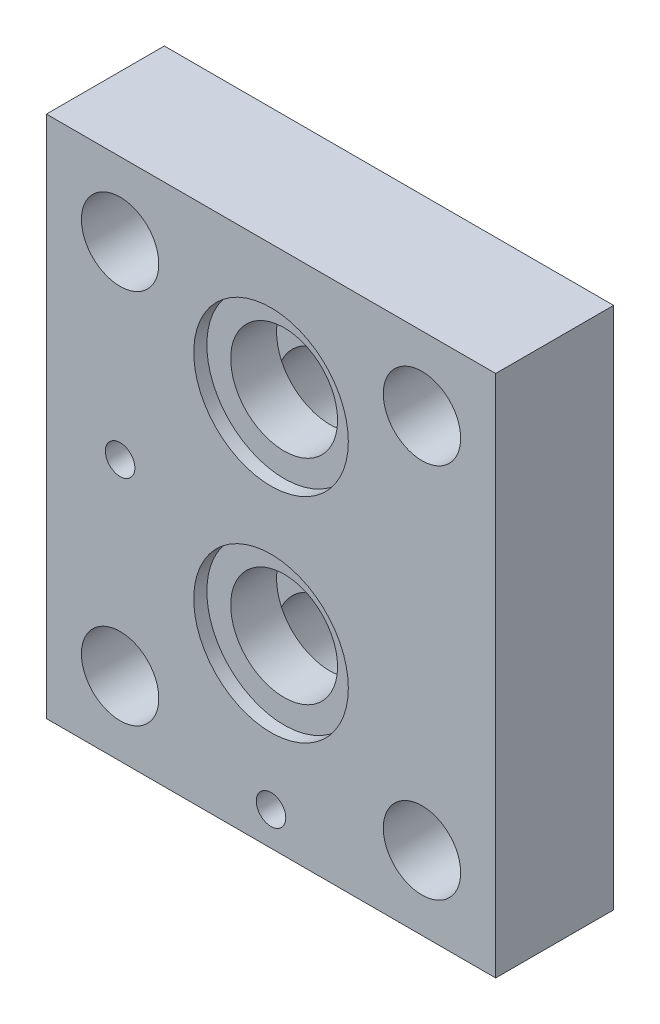
ISO-10303-21;
HEADER;
FILE_DESCRIPTION(('STEP AP214'),'2;1');
FILE_NAME('part.step','',(''),(''),'','','');
FILE_SCHEMA(('AUTOMOTIVE_DESIGN { 1 0 10303 214 1 1 1 1 }'));
ENDSEC;
DATA;
#1=APPLICATION_CONTEXT('core data for automotive mechanical design processes');
#2=APPLICATION_PROTOCOL_DEFINITION('international standard','automotive_design',2000,#1);
#3=PRODUCT_CONTEXT('',#1,'mechanical');
#4=PRODUCT('Part','Part','',(#3));
#5=PRODUCT_RELATED_PRODUCT_CATEGORY('part','',(#4));
#6=PRODUCT_DEFINITION_FORMATION('','',#4);
#7=PRODUCT_DEFINITION_CONTEXT('part definition',#1,'design');
#8=PRODUCT_DEFINITION('design','',#6,#7);
#9=PRODUCT_DEFINITION_SHAPE('','',#8);
#10=(LENGTH_UNIT() NAMED_UNIT(*) SI_UNIT(.MILLI.,.METRE.));
#11=(NAMED_UNIT(*) PLANE_ANGLE_UNIT() SI_UNIT($,.RADIAN.));
#12=(NAMED_UNIT(*) SI_UNIT($,.STERADIAN.) SOLID_ANGLE_UNIT());
#13=UNCERTAINTY_MEASURE_WITH_UNIT(LENGTH_MEASURE(1.E-05),#10,'distance_accuracy_value','');
#14=(GEOMETRIC_REPRESENTATION_CONTEXT(3) GLOBAL_UNCERTAINTY_ASSIGNED_CONTEXT((#13)) GLOBAL_UNIT_ASSIGNED_CONTEXT((#10,
#11,#12)) REPRESENTATION_CONTEXT('',''));
#15=CARTESIAN_POINT('',(0.,0.,0.));
#16=DIRECTION('',(0.,0.,1.));
#17=DIRECTION('',(1.,0.,0.));
#18=AXIS2_PLACEMENT_3D('',#15,#16,#17);
#19=CARTESIAN_POINT('',(0.,27.813,0.));
#20=DIRECTION('',(0.,0.,1.));
#21=DIRECTION('',(1.,0.,0.));
#22=AXIS2_PLACEMENT_3D('',#19,#20,#21);
#23=CYLINDRICAL_SURFACE('',#22,11.509375);
#24=CARTESIAN_POINT('',(0.,27.813,0.));
#25=DIRECTION('',(0.,0.,1.));
#26=DIRECTION('',(1.,0.,0.));
#27=AXIS2_PLACEMENT_3D('',#24,#25,#26);
#28=CIRCLE('',#27,11.509375);
#29=CARTESIAN_POINT('',(-10.4487050341478,22.987,0.));
#30=VERTEX_POINT('',#29);
#31=CARTESIAN_POINT('',(10.4487050341478,22.987,0.));
#32=VERTEX_POINT('',#31);
#33=EDGE_CURVE('E142',#30,#32,#28,.T.);
#34=ORIENTED_EDGE('',*,*,#33,.F.);
#35=EDGE_CURVE('E59',#32,#30,#28,.T.);
#36=ORIENTED_EDGE('',*,*,#35,.F.);
#37=EDGE_LOOP('',(#34,#36));
#38=FACE_BOUND('',#37,.T.);
#39=CARTESIAN_POINT('',(0.,27.813,9.8806));
#40=DIRECTION('',(0.,0.,1.));
#41=DIRECTION('',(1.,0.,0.));
#42=AXIS2_PLACEMENT_3D('',#39,#40,#41);
#43=CIRCLE('',#42,11.509375);
#44=CARTESIAN_POINT('',(11.509375,27.813,9.8806));
#45=VERTEX_POINT('',#44);
#46=EDGE_CURVE('E47',#45,#45,#43,.F.);
#47=ORIENTED_EDGE('',*,*,#46,.F.);
#48=EDGE_LOOP('',(#47));
#49=FACE_BOUND('',#48,.T.);
#50=ADVANCED_FACE('F43',(#38,#49),#23,.F.);
#51=CARTESIAN_POINT('',(0.,-18.161,0.));
#52=DIRECTION('',(0.,0.,1.));
#53=DIRECTION('',(1.,0.,0.));
#54=AXIS2_PLACEMENT_3D('',#51,#52,#53);
#55=CYLINDRICAL_SURFACE('',#54,11.509375);
#56=CARTESIAN_POINT('',(0.,-18.161,0.));
#57=DIRECTION('',(0.,0.,1.));
#58=DIRECTION('',(1.,0.,0.));
#59=AXIS2_PLACEMENT_3D('',#56,#57,#58);
#60=CIRCLE('',#59,11.509375);
#61=CARTESIAN_POINT('',(-10.4487050341478,-22.987,0.));
#62=VERTEX_POINT('',#61);
#63=CARTESIAN_POINT('',(10.4487050341478,-22.987,0.));
#64=VERTEX_POINT('',#63);
#65=EDGE_CURVE('E138',#62,#64,#60,.T.);
#66=ORIENTED_EDGE('',*,*,#65,.F.);
#67=EDGE_CURVE('E66',#64,#62,#60,.T.);
#68=ORIENTED_EDGE('',*,*,#67,.F.);
#69=EDGE_LOOP('',(#66,#68));
#70=FACE_BOUND('',#69,.T.);
#71=CARTESIAN_POINT('',(0.,-18.161,9.8806));
#72=DIRECTION('',(0.,0.,1.));
#73=DIRECTION('',(1.,0.,0.));
#74=AXIS2_PLACEMENT_3D('',#71,#72,#73);
#75=CIRCLE('',#74,11.509375);
#76=CARTESIAN_POINT('',(11.509375,-18.161,9.8806));
#77=VERTEX_POINT('',#76);
#78=EDGE_CURVE('E129',#77,#77,#75,.F.);
#79=ORIENTED_EDGE('',*,*,#78,.F.);
#80=EDGE_LOOP('',(#79));
#81=FACE_BOUND('',#80,.T.);
#82=ADVANCED_FACE('F274',(#70,#81),#55,.F.);
#83=CARTESIAN_POINT('',(48.387,56.388,12.7));
#84=DIRECTION('',(0.,-1.,0.));
#85=DIRECTION('',(0.,0.,-1.));
#86=AXIS2_PLACEMENT_3D('',#83,#84,#85);
#87=PLANE('',#86);
#88=DIRECTION('',(-1.,0.,0.));
#89=VECTOR('',#88,1.);
#90=CARTESIAN_POINT('',(48.387,56.388,-12.7));
#91=LINE('',#90,#89);
#92=CARTESIAN_POINT('',(48.387,56.388,-12.7));
#93=VERTEX_POINT('',#92);
#94=CARTESIAN_POINT('',(-48.387,56.388,-12.7));
#95=VERTEX_POINT('',#94);
#96=EDGE_CURVE('E182',#93,#95,#91,.T.);
#97=ORIENTED_EDGE('',*,*,#96,.T.);
#98=DIRECTION('',(0.,0.,-1.));
#99=VECTOR('',#98,1.);
#100=CARTESIAN_POINT('',(-48.387,56.388,12.7));
#101=LINE('',#100,#99);
#102=CARTESIAN_POINT('',(-48.387,56.388,12.7));
#103=VERTEX_POINT('',#102);
#104=EDGE_CURVE('E11',#103,#95,#101,.T.);
#105=ORIENTED_EDGE('',*,*,#104,.F.);
#106=DIRECTION('',(-1.,0.,0.));
#107=VECTOR('',#106,1.);
#108=CARTESIAN_POINT('',(48.387,56.388,12.7));
#109=LINE('',#108,#107);
#110=CARTESIAN_POINT('',(48.387,56.388,12.7));
#111=VERTEX_POINT('',#110);
#112=EDGE_CURVE('E183',#111,#103,#109,.T.);
#113=ORIENTED_EDGE('',*,*,#112,.F.);
#114=DIRECTION('',(0.,0.,-1.));
#115=VECTOR('',#114,1.);
#116=CARTESIAN_POINT('',(48.387,56.388,12.7));
#117=LINE('',#116,#115);
#118=EDGE_CURVE('E193',#111,#93,#117,.T.);
#119=ORIENTED_EDGE('',*,*,#118,.T.);
#120=EDGE_LOOP('',(#97,#105,#113,#119));
#121=FACE_BOUND('',#120,.T.);
#122=ADVANCED_FACE('F45',(#121),#87,.F.);
#123=CARTESIAN_POINT('',(-48.387,-56.388,12.7));
#124=DIRECTION('',(1.,0.,0.));
#125=DIRECTION('',(0.,0.,-1.));
#126=AXIS2_PLACEMENT_3D('',#123,#124,#125);
#127=PLANE('',#126);
#128=DIRECTION('',(0.,-1.,0.));
#129=VECTOR('',#128,1.);
#130=CARTESIAN_POINT('',(-48.387,-56.388,-12.7));
#131=LINE('',#130,#129);
#132=CARTESIAN_POINT('',(-48.387,-56.388,-12.7));
#133=VERTEX_POINT('',#132);
#134=EDGE_CURVE('E196',#95,#133,#131,.T.);
#135=ORIENTED_EDGE('',*,*,#134,.T.);
#136=DIRECTION('',(0.,0.,-1.));
#137=VECTOR('',#136,1.);
#138=CARTESIAN_POINT('',(-48.387,-56.388,12.7));
#139=LINE('',#138,#137);
#140=CARTESIAN_POINT('',(-48.387,-56.388,12.7));
#141=VERTEX_POINT('',#140);
#142=EDGE_CURVE('E52',#141,#133,#139,.T.);
#143=ORIENTED_EDGE('',*,*,#142,.F.);
#144=DIRECTION('',(0.,-1.,0.));
#145=VECTOR('',#144,1.);
#146=CARTESIAN_POINT('',(-48.387,-56.388,12.7));
#147=LINE('',#146,#145);
#148=EDGE_CURVE('E186',#103,#141,#147,.T.);
#149=ORIENTED_EDGE('',*,*,#148,.F.);
#150=ORIENTED_EDGE('',*,*,#104,.T.);
#151=EDGE_LOOP('',(#135,#143,#149,#150));
#152=FACE_BOUND('',#151,.T.);
#153=ADVANCED_FACE('F259',(#152),#127,.F.);
#154=CARTESIAN_POINT('',(48.387,-56.388,12.7));
#155=DIRECTION('',(0.,1.,0.));
#156=DIRECTION('',(0.,0.,1.));
#157=AXIS2_PLACEMENT_3D('',#154,#155,#156);
#158=PLANE('',#157);
#159=DIRECTION('',(1.,0.,0.));
#160=VECTOR('',#159,1.);
#161=CARTESIAN_POINT('',(48.387,-56.388,-12.7));
#162=LINE('',#161,#160);
#163=CARTESIAN_POINT('',(48.387,-56.388,-12.7));
#164=VERTEX_POINT('',#163);
#165=EDGE_CURVE('E198',#133,#164,#162,.T.);
#166=ORIENTED_EDGE('',*,*,#165,.T.);
#167=DIRECTION('',(0.,0.,-1.));
#168=VECTOR('',#167,1.);
#169=CARTESIAN_POINT('',(48.387,-56.388,12.7));
#170=LINE('',#169,#168);
#171=CARTESIAN_POINT('',(48.387,-56.388,12.7));
#172=VERTEX_POINT('',#171);
#173=EDGE_CURVE('E203',#172,#164,#170,.T.);
#174=ORIENTED_EDGE('',*,*,#173,.F.);
#175=DIRECTION('',(1.,0.,0.));
#176=VECTOR('',#175,1.);
#177=CARTESIAN_POINT('',(48.387,-56.388,12.7));
#178=LINE('',#177,#176);
#179=EDGE_CURVE('E189',#141,#172,#178,.T.);
#180=ORIENTED_EDGE('',*,*,#179,.F.);
#181=ORIENTED_EDGE('',*,*,#142,.T.);
#182=EDGE_LOOP('',(#166,#174,#180,#181));
#183=FACE_BOUND('',#182,.T.);
#184=ADVANCED_FACE('F256',(#183),#158,.F.);
#185=CARTESIAN_POINT('',(48.387,-56.388,12.7));
#186=DIRECTION('',(-1.,0.,0.));
#187=DIRECTION('',(0.,0.,1.));
#188=AXIS2_PLACEMENT_3D('',#185,#186,#187);
#189=PLANE('',#188);
#190=DIRECTION('',(0.,1.,0.));
#191=VECTOR('',#190,1.);
#192=CARTESIAN_POINT('',(48.387,-56.388,-12.7));
#193=LINE('',#192,#191);
#194=EDGE_CURVE('E187',#164,#93,#193,.T.);
#195=ORIENTED_EDGE('',*,*,#194,.T.);
#196=ORIENTED_EDGE('',*,*,#118,.F.);
#197=DIRECTION('',(0.,1.,0.));
#198=VECTOR('',#197,1.);
#199=CARTESIAN_POINT('',(48.387,-56.388,12.7));
#200=LINE('',#199,#198);
#201=EDGE_CURVE('E191',#172,#111,#200,.T.);
#202=ORIENTED_EDGE('',*,*,#201,.F.);
#203=ORIENTED_EDGE('',*,*,#173,.T.);
#204=EDGE_LOOP('',(#195,#196,#202,#203));
#205=FACE_BOUND('',#204,.T.);
#206=ADVANCED_FACE('F252',(#205),#189,.F.);
#207=CARTESIAN_POINT('',(0.,0.,12.7));
#208=DIRECTION('',(0.,0.,-1.));
#209=DIRECTION('',(-1.,0.,0.));
#210=AXIS2_PLACEMENT_3D('',#207,#208,#209);
#211=PLANE('',#210);
#212=CARTESIAN_POINT('',(0.,-49.149,12.7));
#213=DIRECTION('',(0.,0.,1.));
#214=DIRECTION('',(1.,0.,0.));
#215=AXIS2_PLACEMENT_3D('',#212,#213,#214);
#216=CIRCLE('',#215,3.175);
#217=CARTESIAN_POINT('',(3.175,-49.149,12.7));
#218=VERTEX_POINT('',#217);
#219=EDGE_CURVE('E489',#218,#218,#216,.T.);
#220=ORIENTED_EDGE('',*,*,#219,.F.);
#221=EDGE_LOOP('',(#220));
#222=FACE_BOUND('',#221,.T.);
#223=CARTESIAN_POINT('',(-32.512,-0.127000000000009,12.7));
#224=DIRECTION('',(0.,0.,1.));
#225=DIRECTION('',(1.,0.,0.));
#226=AXIS2_PLACEMENT_3D('',#223,#224,#225);
#227=CIRCLE('',#226,3.175);
#228=CARTESIAN_POINT('',(-29.337,-0.127000000000009,12.7));
#229=VERTEX_POINT('',#228);
#230=EDGE_CURVE('E492',#229,#229,#227,.T.);
#231=ORIENTED_EDGE('',*,*,#230,.F.);
#232=EDGE_LOOP('',(#231));
#233=FACE_BOUND('',#232,.T.);
#234=CARTESIAN_POINT('',(0.,-18.161,12.7));
#235=DIRECTION('',(0.,0.,1.));
#236=DIRECTION('',(1.,0.,0.));
#237=AXIS2_PLACEMENT_3D('',#234,#235,#236);
#238=CIRCLE('',#237,16.6497);
#239=CARTESIAN_POINT('',(16.6497,-18.161,12.7));
#240=VERTEX_POINT('',#239);
#241=EDGE_CURVE('E130',#240,#240,#238,.T.);
#242=ORIENTED_EDGE('',*,*,#241,.F.);
#243=EDGE_LOOP('',(#242));
#244=FACE_BOUND('',#243,.T.);
#245=CARTESIAN_POINT('',(0.,27.813,12.7));
#246=DIRECTION('',(0.,0.,1.));
#247=DIRECTION('',(1.,0.,0.));
#248=AXIS2_PLACEMENT_3D('',#245,#246,#247);
#249=CIRCLE('',#248,16.6497);
#250=CARTESIAN_POINT('',(16.6497,27.813,12.7));
#251=VERTEX_POINT('',#250);
#252=EDGE_CURVE('E133',#251,#251,#249,.T.);
#253=ORIENTED_EDGE('',*,*,#252,.F.);
#254=EDGE_LOOP('',(#253));
#255=FACE_BOUND('',#254,.T.);
#256=CARTESIAN_POINT('',(32.512,-40.513,12.7));
#257=DIRECTION('',(0.,0.,-1.));
#258=DIRECTION('',(-1.,0.,0.));
#259=AXIS2_PLACEMENT_3D('',#256,#257,#258);
#260=CIRCLE('',#259,8.33437499999998);
#261=CARTESIAN_POINT('',(24.177625,-40.513,12.7));
#262=VERTEX_POINT('',#261);
#263=EDGE_CURVE('E161',#262,#262,#260,.T.);
#264=ORIENTED_EDGE('',*,*,#263,.T.);
#265=EDGE_LOOP('',(#264));
#266=FACE_BOUND('',#265,.T.);
#267=CARTESIAN_POINT('',(32.512,40.513,12.7));
#268=DIRECTION('',(0.,0.,-1.));
#269=DIRECTION('',(-1.,0.,0.));
#270=AXIS2_PLACEMENT_3D('',#267,#268,#269);
#271=CIRCLE('',#270,8.33437499999998);
#272=CARTESIAN_POINT('',(24.177625,40.513,12.7));
#273=VERTEX_POINT('',#272);
#274=EDGE_CURVE('E167',#273,#273,#271,.T.);
#275=ORIENTED_EDGE('',*,*,#274,.T.);
#276=EDGE_LOOP('',(#275));
#277=FACE_BOUND('',#276,.T.);
#278=CARTESIAN_POINT('',(-32.512,-40.513,12.7));
#279=DIRECTION('',(0.,0.,-1.));
#280=DIRECTION('',(-1.,0.,0.));
#281=AXIS2_PLACEMENT_3D('',#278,#279,#280);
#282=CIRCLE('',#281,8.33437499999998);
#283=CARTESIAN_POINT('',(-40.846375,-40.513,12.7));
#284=VERTEX_POINT('',#283);
#285=EDGE_CURVE('E173',#284,#284,#282,.T.);
#286=ORIENTED_EDGE('',*,*,#285,.T.);
#287=EDGE_LOOP('',(#286));
#288=FACE_BOUND('',#287,.T.);
#289=CARTESIAN_POINT('',(-32.512,40.513,12.7));
#290=DIRECTION('',(0.,0.,-1.));
#291=DIRECTION('',(-1.,0.,0.));
#292=AXIS2_PLACEMENT_3D('',#289,#290,#291);
#293=CIRCLE('',#292,8.33437499999998);
#294=CARTESIAN_POINT('',(-40.846375,40.513,12.7));
#295=VERTEX_POINT('',#294);
#296=EDGE_CURVE('E179',#295,#295,#293,.T.);
#297=ORIENTED_EDGE('',*,*,#296,.T.);
#298=EDGE_LOOP('',(#297));
#299=FACE_BOUND('',#298,.T.);
#300=ORIENTED_EDGE('',*,*,#112,.T.);
#301=ORIENTED_EDGE('',*,*,#148,.T.);
#302=ORIENTED_EDGE('',*,*,#179,.T.);
#303=ORIENTED_EDGE('',*,*,#201,.T.);
#304=EDGE_LOOP('',(#300,#301,#302,#303));
#305=FACE_BOUND('',#304,.T.);
#306=ADVANCED_FACE('F232',(#222,#233,#244,#255,#266,#277,#288,#299,#305),#211,.F.);
#307=CARTESIAN_POINT('',(0.,0.,-12.7));
#308=DIRECTION('',(0.,0.,-1.));
#309=DIRECTION('',(-1.,0.,0.));
#310=AXIS2_PLACEMENT_3D('',#307,#308,#309);
#311=PLANE('',#310);
#312=CARTESIAN_POINT('',(0.,49.149,-12.7));
#313=DIRECTION('',(0.,0.,-1.));
#314=DIRECTION('',(-1.,0.,0.));
#315=AXIS2_PLACEMENT_3D('',#312,#313,#314);
#316=CIRCLE('',#315,3.57187499999999);
#317=CARTESIAN_POINT('',(-3.57187499999999,49.149,-12.7));
#318=VERTEX_POINT('',#317);
#319=EDGE_CURVE('E113',#318,#318,#316,.T.);
#320=ORIENTED_EDGE('',*,*,#319,.F.);
#321=EDGE_LOOP('',(#320));
#322=FACE_BOUND('',#321,.T.);
#323=CARTESIAN_POINT('',(32.512,0.126999999999986,-12.7));
#324=DIRECTION('',(0.,0.,-1.));
#325=DIRECTION('',(-1.,0.,0.));
#326=AXIS2_PLACEMENT_3D('',#323,#324,#325);
#327=CIRCLE('',#326,3.57187499999999);
#328=CARTESIAN_POINT('',(28.940125,0.126999999999986,-12.7));
#329=VERTEX_POINT('',#328);
#330=EDGE_CURVE('E112',#329,#329,#327,.T.);
#331=ORIENTED_EDGE('',*,*,#330,.F.);
#332=EDGE_LOOP('',(#331));
#333=FACE_BOUND('',#332,.T.);
#334=CARTESIAN_POINT('',(0.,-27.813,-12.7));
#335=DIRECTION('',(0.,0.,1.));
#336=DIRECTION('',(1.,0.,0.));
#337=AXIS2_PLACEMENT_3D('',#334,#335,#336);
#338=CIRCLE('',#337,11.509375);
#339=CARTESIAN_POINT('',(11.509375,-27.813,-12.7));
#340=VERTEX_POINT('',#339);
#341=EDGE_CURVE('E150',#340,#340,#338,.T.);
#342=ORIENTED_EDGE('',*,*,#341,.T.);
#343=EDGE_LOOP('',(#342));
#344=FACE_BOUND('',#343,.T.);
#345=CARTESIAN_POINT('',(0.,18.161,-12.7));
#346=DIRECTION('',(0.,0.,1.));
#347=DIRECTION('',(1.,0.,0.));
#348=AXIS2_PLACEMENT_3D('',#345,#346,#347);
#349=CIRCLE('',#348,11.509375);
#350=CARTESIAN_POINT('',(11.509375,18.161,-12.7));
#351=VERTEX_POINT('',#350);
#352=EDGE_CURVE('E153',#351,#351,#349,.T.);
#353=ORIENTED_EDGE('',*,*,#352,.T.);
#354=EDGE_LOOP('',(#353));
#355=FACE_BOUND('',#354,.T.);
#356=CARTESIAN_POINT('',(32.512,-40.513,-12.7));
#357=DIRECTION('',(0.,0.,-1.));
#358=DIRECTION('',(-1.,0.,0.));
#359=AXIS2_PLACEMENT_3D('',#356,#357,#358);
#360=CIRCLE('',#359,8.33437499999999);
#361=CARTESIAN_POINT('',(24.177625,-40.513,-12.7));
#362=VERTEX_POINT('',#361);
#363=EDGE_CURVE('E148',#362,#362,#360,.T.);
#364=ORIENTED_EDGE('',*,*,#363,.F.);
#365=EDGE_LOOP('',(#364));
#366=FACE_BOUND('',#365,.T.);
#367=CARTESIAN_POINT('',(32.512,40.513,-12.7));
#368=DIRECTION('',(0.,0.,-1.));
#369=DIRECTION('',(-1.,0.,0.));
#370=AXIS2_PLACEMENT_3D('',#367,#368,#369);
#371=CIRCLE('',#370,8.33437499999999);
#372=CARTESIAN_POINT('',(24.177625,40.513,-12.7));
#373=VERTEX_POINT('',#372);
#374=EDGE_CURVE('E164',#373,#373,#371,.T.);
#375=ORIENTED_EDGE('',*,*,#374,.F.);
#376=EDGE_LOOP('',(#375));
#377=FACE_BOUND('',#376,.T.);
#378=CARTESIAN_POINT('',(-32.512,-40.513,-12.7));
#379=DIRECTION('',(0.,0.,-1.));
#380=DIRECTION('',(-1.,0.,0.));
#381=AXIS2_PLACEMENT_3D('',#378,#379,#380);
#382=CIRCLE('',#381,8.33437499999999);
#383=CARTESIAN_POINT('',(-40.846375,-40.513,-12.7));
#384=VERTEX_POINT('',#383);
#385=EDGE_CURVE('E170',#384,#384,#382,.T.);
#386=ORIENTED_EDGE('',*,*,#385,.F.);
#387=EDGE_LOOP('',(#386));
#388=FACE_BOUND('',#387,.T.);
#389=CARTESIAN_POINT('',(-32.512,40.513,-12.7));
#390=DIRECTION('',(0.,0.,-1.));
#391=DIRECTION('',(-1.,0.,0.));
#392=AXIS2_PLACEMENT_3D('',#389,#390,#391);
#393=CIRCLE('',#392,8.33437499999999);
#394=CARTESIAN_POINT('',(-40.846375,40.513,-12.7));
#395=VERTEX_POINT('',#394);
#396=EDGE_CURVE('E176',#395,#395,#393,.T.);
#397=ORIENTED_EDGE('',*,*,#396,.F.);
#398=EDGE_LOOP('',(#397));
#399=FACE_BOUND('',#398,.T.);
#400=ORIENTED_EDGE('',*,*,#96,.F.);
#401=ORIENTED_EDGE('',*,*,#194,.F.);
#402=ORIENTED_EDGE('',*,*,#165,.F.);
#403=ORIENTED_EDGE('',*,*,#134,.F.);
#404=EDGE_LOOP('',(#400,#401,#402,#403));
#405=FACE_BOUND('',#404,.T.);
#406=ADVANCED_FACE('F228',(#322,#333,#344,#355,#366,#377,#388,#399,#405),#311,.T.);
#407=CARTESIAN_POINT('',(-32.512,40.513,-12.7));
#408=DIRECTION('',(0.,0.,-1.));
#409=DIRECTION('',(-1.,0.,0.));
#410=AXIS2_PLACEMENT_3D('',#407,#408,#409);
#411=CYLINDRICAL_SURFACE('',#410,8.33437499999999);
#412=ORIENTED_EDGE('',*,*,#296,.F.);
#413=EDGE_LOOP('',(#412));
#414=FACE_BOUND('',#413,.T.);
#415=ORIENTED_EDGE('',*,*,#396,.T.);
#416=EDGE_LOOP('',(#415));
#417=FACE_BOUND('',#416,.T.);
#418=ADVANCED_FACE('F231',(#414,#417),#411,.F.);
#419=CARTESIAN_POINT('',(-32.512,-40.513,-12.7));
#420=DIRECTION('',(0.,0.,-1.));
#421=DIRECTION('',(-1.,0.,0.));
#422=AXIS2_PLACEMENT_3D('',#419,#420,#421);
#423=CYLINDRICAL_SURFACE('',#422,8.33437499999999);
#424=ORIENTED_EDGE('',*,*,#285,.F.);
#425=EDGE_LOOP('',(#424));
#426=FACE_BOUND('',#425,.T.);
#427=ORIENTED_EDGE('',*,*,#385,.T.);
#428=EDGE_LOOP('',(#427));
#429=FACE_BOUND('',#428,.T.);
#430=ADVANCED_FACE('F302',(#426,#429),#423,.F.);
#431=CARTESIAN_POINT('',(32.512,40.513,-12.7));
#432=DIRECTION('',(0.,0.,-1.));
#433=DIRECTION('',(-1.,0.,0.));
#434=AXIS2_PLACEMENT_3D('',#431,#432,#433);
#435=CYLINDRICAL_SURFACE('',#434,8.33437499999999);
#436=ORIENTED_EDGE('',*,*,#274,.F.);
#437=EDGE_LOOP('',(#436));
#438=FACE_BOUND('',#437,.T.);
#439=ORIENTED_EDGE('',*,*,#374,.T.);
#440=EDGE_LOOP('',(#439));
#441=FACE_BOUND('',#440,.T.);
#442=ADVANCED_FACE('F298',(#438,#441),#435,.F.);
#443=CARTESIAN_POINT('',(32.512,-40.513,-12.7));
#444=DIRECTION('',(0.,0.,-1.));
#445=DIRECTION('',(-1.,0.,0.));
#446=AXIS2_PLACEMENT_3D('',#443,#444,#445);
#447=CYLINDRICAL_SURFACE('',#446,8.33437499999999);
#448=ORIENTED_EDGE('',*,*,#263,.F.);
#449=EDGE_LOOP('',(#448));
#450=FACE_BOUND('',#449,.T.);
#451=ORIENTED_EDGE('',*,*,#363,.T.);
#452=EDGE_LOOP('',(#451));
#453=FACE_BOUND('',#452,.T.);
#454=ADVANCED_FACE('F224',(#450,#453),#447,.F.);
#455=CARTESIAN_POINT('',(0.,18.161,0.));
#456=DIRECTION('',(0.,0.,-1.));
#457=DIRECTION('',(-1.,0.,0.));
#458=AXIS2_PLACEMENT_3D('',#455,#456,#457);
#459=CYLINDRICAL_SURFACE('',#458,11.509375);
#460=CARTESIAN_POINT('',(0.,18.161,0.));
#461=DIRECTION('',(0.,0.,1.));
#462=DIRECTION('',(1.,0.,0.));
#463=AXIS2_PLACEMENT_3D('',#460,#461,#462);
#464=CIRCLE('',#463,11.509375);
#465=EDGE_CURVE('E156',#32,#30,#464,.T.);
#466=ORIENTED_EDGE('',*,*,#465,.T.);
#467=EDGE_CURVE('E141',#30,#32,#464,.T.);
#468=ORIENTED_EDGE('',*,*,#467,.T.);
#469=EDGE_LOOP('',(#466,#468));
#470=FACE_BOUND('',#469,.T.);
#471=ORIENTED_EDGE('',*,*,#352,.F.);
#472=EDGE_LOOP('',(#471));
#473=FACE_BOUND('',#472,.T.);
#474=ADVANCED_FACE('F221',(#470,#473),#459,.F.);
#475=CARTESIAN_POINT('',(0.,18.161,0.));
#476=DIRECTION('',(0.,0.,1.));
#477=DIRECTION('',(1.,0.,0.));
#478=AXIS2_PLACEMENT_3D('',#475,#476,#477);
#479=PLANE('',#478);
#480=ORIENTED_EDGE('',*,*,#467,.F.);
#481=ORIENTED_EDGE('',*,*,#33,.T.);
#482=EDGE_LOOP('',(#480,#481));
#483=FACE_BOUND('',#482,.T.);
#484=ADVANCED_FACE('F219',(#483),#479,.F.);
#485=CARTESIAN_POINT('',(0.,-27.813,0.));
#486=DIRECTION('',(0.,0.,-1.));
#487=DIRECTION('',(-1.,0.,0.));
#488=AXIS2_PLACEMENT_3D('',#485,#486,#487);
#489=CYLINDRICAL_SURFACE('',#488,11.509375);
#490=CARTESIAN_POINT('',(0.,-27.813,0.));
#491=DIRECTION('',(0.,0.,1.));
#492=DIRECTION('',(1.,0.,0.));
#493=AXIS2_PLACEMENT_3D('',#490,#491,#492);
#494=CIRCLE('',#493,11.509375);
#495=EDGE_CURVE('E145',#64,#62,#494,.T.);
#496=ORIENTED_EDGE('',*,*,#495,.T.);
#497=EDGE_CURVE('E149',#62,#64,#494,.T.);
#498=ORIENTED_EDGE('',*,*,#497,.T.);
#499=EDGE_LOOP('',(#496,#498));
#500=FACE_BOUND('',#499,.T.);
#501=ORIENTED_EDGE('',*,*,#341,.F.);
#502=EDGE_LOOP('',(#501));
#503=FACE_BOUND('',#502,.T.);
#504=ADVANCED_FACE('F289',(#500,#503),#489,.F.);
#505=CARTESIAN_POINT('',(0.,-27.813,0.));
#506=DIRECTION('',(0.,0.,1.));
#507=DIRECTION('',(1.,0.,0.));
#508=AXIS2_PLACEMENT_3D('',#505,#506,#507);
#509=PLANE('',#508);
#510=ORIENTED_EDGE('',*,*,#497,.F.);
#511=ORIENTED_EDGE('',*,*,#65,.T.);
#512=EDGE_LOOP('',(#510,#511));
#513=FACE_BOUND('',#512,.T.);
#514=ADVANCED_FACE('F286',(#513),#509,.F.);
#515=CARTESIAN_POINT('',(0.,27.813,0.));
#516=DIRECTION('',(0.,0.,1.));
#517=DIRECTION('',(1.,0.,0.));
#518=AXIS2_PLACEMENT_3D('',#515,#516,#517);
#519=PLANE('',#518);
#520=ORIENTED_EDGE('',*,*,#35,.T.);
#521=ORIENTED_EDGE('',*,*,#465,.F.);
#522=EDGE_LOOP('',(#520,#521));
#523=FACE_BOUND('',#522,.T.);
#524=ADVANCED_FACE('F214',(#523),#519,.T.);
#525=CARTESIAN_POINT('',(0.,-18.161,0.));
#526=DIRECTION('',(0.,0.,1.));
#527=DIRECTION('',(1.,0.,0.));
#528=AXIS2_PLACEMENT_3D('',#525,#526,#527);
#529=PLANE('',#528);
#530=ORIENTED_EDGE('',*,*,#67,.T.);
#531=ORIENTED_EDGE('',*,*,#495,.F.);
#532=EDGE_LOOP('',(#530,#531));
#533=FACE_BOUND('',#532,.T.);
#534=ADVANCED_FACE('F285',(#533),#529,.T.);
#535=CARTESIAN_POINT('',(0.,-18.161,9.8806));
#536=DIRECTION('',(0.,0.,1.));
#537=DIRECTION('',(1.,0.,0.));
#538=AXIS2_PLACEMENT_3D('',#535,#536,#537);
#539=PLANE('',#538);
#540=CARTESIAN_POINT('',(0.,-18.161,9.8806));
#541=DIRECTION('',(0.,0.,1.));
#542=DIRECTION('',(1.,0.,0.));
#543=AXIS2_PLACEMENT_3D('',#540,#541,#542);
#544=CIRCLE('',#543,16.6497);
#545=CARTESIAN_POINT('',(16.6497,-18.161,9.8806));
#546=VERTEX_POINT('',#545);
#547=EDGE_CURVE('E126',#546,#546,#544,.T.);
#548=ORIENTED_EDGE('',*,*,#547,.T.);
#549=EDGE_LOOP('',(#548));
#550=FACE_BOUND('',#549,.T.);
#551=ORIENTED_EDGE('',*,*,#78,.T.);
#552=EDGE_LOOP('',(#551));
#553=FACE_BOUND('',#552,.T.);
#554=ADVANCED_FACE('F362',(#550,#553),#539,.T.);
#555=CARTESIAN_POINT('',(0.,-18.161,9.8806));
#556=DIRECTION('',(0.,0.,1.));
#557=DIRECTION('',(1.,0.,0.));
#558=AXIS2_PLACEMENT_3D('',#555,#556,#557);
#559=CYLINDRICAL_SURFACE('',#558,16.6497);
#560=ORIENTED_EDGE('',*,*,#547,.F.);
#561=EDGE_LOOP('',(#560));
#562=FACE_BOUND('',#561,.T.);
#563=ORIENTED_EDGE('',*,*,#241,.T.);
#564=EDGE_LOOP('',(#563));
#565=FACE_BOUND('',#564,.T.);
#566=ADVANCED_FACE('F383',(#562,#565),#559,.F.);
#567=CARTESIAN_POINT('',(0.,27.813,9.8806));
#568=DIRECTION('',(0.,0.,1.));
#569=DIRECTION('',(1.,0.,0.));
#570=AXIS2_PLACEMENT_3D('',#567,#568,#569);
#571=PLANE('',#570);
#572=CARTESIAN_POINT('',(0.,27.813,9.8806));
#573=DIRECTION('',(0.,0.,1.));
#574=DIRECTION('',(1.,0.,0.));
#575=AXIS2_PLACEMENT_3D('',#572,#573,#574);
#576=CIRCLE('',#575,16.6497);
#577=CARTESIAN_POINT('',(16.6497,27.813,9.8806));
#578=VERTEX_POINT('',#577);
#579=EDGE_CURVE('E125',#578,#578,#576,.T.);
#580=ORIENTED_EDGE('',*,*,#579,.T.);
#581=EDGE_LOOP('',(#580));
#582=FACE_BOUND('',#581,.T.);
#583=ORIENTED_EDGE('',*,*,#46,.T.);
#584=EDGE_LOOP('',(#583));
#585=FACE_BOUND('',#584,.T.);
#586=ADVANCED_FACE('F393',(#582,#585),#571,.T.);
#587=CARTESIAN_POINT('',(0.,27.813,9.8806));
#588=DIRECTION('',(0.,0.,1.));
#589=DIRECTION('',(1.,0.,0.));
#590=AXIS2_PLACEMENT_3D('',#587,#588,#589);
#591=CYLINDRICAL_SURFACE('',#590,16.6497);
#592=ORIENTED_EDGE('',*,*,#579,.F.);
#593=EDGE_LOOP('',(#592));
#594=FACE_BOUND('',#593,.T.);
#595=ORIENTED_EDGE('',*,*,#252,.T.);
#596=EDGE_LOOP('',(#595));
#597=FACE_BOUND('',#596,.T.);
#598=ADVANCED_FACE('F403',(#594,#597),#591,.F.);
#599=CARTESIAN_POINT('',(32.512,0.126999999999986,-4.82600000000001));
#600=DIRECTION('',(0.,0.,-1.));
#601=DIRECTION('',(-1.,0.,0.));
#602=AXIS2_PLACEMENT_3D('',#599,#600,#601);
#603=CONICAL_SURFACE('',#602,3.57187499999999,1.02974425867665);
#604=CARTESIAN_POINT('',(32.512,0.126999999999986,-2.67980097641094));
#605=VERTEX_POINT('',#604);
#606=VERTEX_LOOP('',#605);
#607=FACE_BOUND('',#606,.T.);
#608=CARTESIAN_POINT('',(32.512,0.126999999999986,-4.82600000000001));
#609=DIRECTION('',(0.,0.,-1.));
#610=DIRECTION('',(-1.,0.,0.));
#611=AXIS2_PLACEMENT_3D('',#608,#609,#610);
#612=CIRCLE('',#611,3.57187499999999);
#613=CARTESIAN_POINT('',(28.940125,0.126999999999986,-4.82600000000001));
#614=VERTEX_POINT('',#613);
#615=EDGE_CURVE('E116',#614,#614,#612,.T.);
#616=ORIENTED_EDGE('',*,*,#615,.T.);
#617=EDGE_LOOP('',(#616));
#618=FACE_BOUND('',#617,.T.);
#619=ADVANCED_FACE('F413',(#607,#618),#603,.F.);
#620=CARTESIAN_POINT('',(32.512,0.126999999999986,-12.7));
#621=DIRECTION('',(0.,0.,-1.));
#622=DIRECTION('',(-1.,0.,0.));
#623=AXIS2_PLACEMENT_3D('',#620,#621,#622);
#624=CYLINDRICAL_SURFACE('',#623,3.57187499999999);
#625=ORIENTED_EDGE('',*,*,#615,.F.);
#626=EDGE_LOOP('',(#625));
#627=FACE_BOUND('',#626,.T.);
#628=ORIENTED_EDGE('',*,*,#330,.T.);
#629=EDGE_LOOP('',(#628));
#630=FACE_BOUND('',#629,.T.);
#631=ADVANCED_FACE('F106',(#627,#630),#624,.F.);
#632=CARTESIAN_POINT('',(0.,49.149,-4.82600000000001));
#633=DIRECTION('',(0.,0.,-1.));
#634=DIRECTION('',(-1.,0.,0.));
#635=AXIS2_PLACEMENT_3D('',#632,#633,#634);
#636=CONICAL_SURFACE('',#635,3.57187499999999,1.02974425867665);
#637=CARTESIAN_POINT('',(0.,49.149,-2.67980097641094));
#638=VERTEX_POINT('',#637);
#639=VERTEX_LOOP('',#638);
#640=FACE_BOUND('',#639,.T.);
#641=CARTESIAN_POINT('',(0.,49.149,-4.82600000000001));
#642=DIRECTION('',(0.,0.,-1.));
#643=DIRECTION('',(-1.,0.,0.));
#644=AXIS2_PLACEMENT_3D('',#641,#642,#643);
#645=CIRCLE('',#644,3.57187499999999);
#646=CARTESIAN_POINT('',(-3.57187499999999,49.149,-4.82600000000001));
#647=VERTEX_POINT('',#646);
#648=EDGE_CURVE('E110',#647,#647,#645,.T.);
#649=ORIENTED_EDGE('',*,*,#648,.T.);
#650=EDGE_LOOP('',(#649));
#651=FACE_BOUND('',#650,.T.);
#652=ADVANCED_FACE('F102',(#640,#651),#636,.F.);
#653=CARTESIAN_POINT('',(0.,49.149,-12.7));
#654=DIRECTION('',(0.,0.,-1.));
#655=DIRECTION('',(-1.,0.,0.));
#656=AXIS2_PLACEMENT_3D('',#653,#654,#655);
#657=CYLINDRICAL_SURFACE('',#656,3.57187499999999);
#658=ORIENTED_EDGE('',*,*,#648,.F.);
#659=EDGE_LOOP('',(#658));
#660=FACE_BOUND('',#659,.T.);
#661=ORIENTED_EDGE('',*,*,#319,.T.);
#662=EDGE_LOOP('',(#661));
#663=FACE_BOUND('',#662,.T.);
#664=ADVANCED_FACE('F105',(#660,#663),#657,.F.);
#665=CARTESIAN_POINT('',(-32.512,-0.127000000000009,4.826));
#666=DIRECTION('',(0.,0.,1.));
#667=DIRECTION('',(1.,0.,0.));
#668=AXIS2_PLACEMENT_3D('',#665,#666,#667);
#669=CYLINDRICAL_SURFACE('',#668,3.175);
#670=CARTESIAN_POINT('',(-32.512,-0.127000000000009,4.826));
#671=DIRECTION('',(0.,0.,1.));
#672=DIRECTION('',(1.,0.,0.));
#673=AXIS2_PLACEMENT_3D('',#670,#671,#672);
#674=CIRCLE('',#673,3.175);
#675=CARTESIAN_POINT('',(-29.337,-0.127000000000009,4.826));
#676=VERTEX_POINT('',#675);
#677=EDGE_CURVE('E496',#676,#676,#674,.T.);
#678=ORIENTED_EDGE('',*,*,#677,.F.);
#679=EDGE_LOOP('',(#678));
#680=FACE_BOUND('',#679,.T.);
#681=ORIENTED_EDGE('',*,*,#230,.T.);
#682=EDGE_LOOP('',(#681));
#683=FACE_BOUND('',#682,.T.);
#684=ADVANCED_FACE('F446',(#680,#683),#669,.F.);
#685=CARTESIAN_POINT('',(-32.512,-0.127000000000009,4.826));
#686=DIRECTION('',(0.,0.,1.));
#687=DIRECTION('',(1.,0.,0.));
#688=AXIS2_PLACEMENT_3D('',#685,#686,#687);
#689=PLANE('',#688);
#690=ORIENTED_EDGE('',*,*,#677,.T.);
#691=EDGE_LOOP('',(#690));
#692=FACE_BOUND('',#691,.T.);
#693=ADVANCED_FACE('F454',(#692),#689,.T.);
#694=CARTESIAN_POINT('',(0.,-49.149,4.826));
#695=DIRECTION('',(0.,0.,1.));
#696=DIRECTION('',(1.,0.,0.));
#697=AXIS2_PLACEMENT_3D('',#694,#695,#696);
#698=CYLINDRICAL_SURFACE('',#697,3.175);
#699=CARTESIAN_POINT('',(0.,-49.149,4.826));
#700=DIRECTION('',(0.,0.,1.));
#701=DIRECTION('',(1.,0.,0.));
#702=AXIS2_PLACEMENT_3D('',#699,#700,#701);
#703=CIRCLE('',#702,3.175);
#704=CARTESIAN_POINT('',(3.175,-49.149,4.826));
#705=VERTEX_POINT('',#704);
#706=EDGE_CURVE('E119',#705,#705,#703,.T.);
#707=ORIENTED_EDGE('',*,*,#706,.F.);
#708=EDGE_LOOP('',(#707));
#709=FACE_BOUND('',#708,.T.);
#710=ORIENTED_EDGE('',*,*,#219,.T.);
#711=EDGE_LOOP('',(#710));
#712=FACE_BOUND('',#711,.T.);
#713=ADVANCED_FACE('F464',(#709,#712),#698,.F.);
#714=CARTESIAN_POINT('',(0.,-49.149,4.826));
#715=DIRECTION('',(0.,0.,1.));
#716=DIRECTION('',(1.,0.,0.));
#717=AXIS2_PLACEMENT_3D('',#714,#715,#716);
#718=PLANE('',#717);
#719=ORIENTED_EDGE('',*,*,#706,.T.);
#720=EDGE_LOOP('',(#719));
#721=FACE_BOUND('',#720,.T.);
#722=ADVANCED_FACE('F474',(#721),#718,.T.);
#723=CLOSED_SHELL('',(#50,#82,#122,#153,#184,#206,#306,#406,#418,#430,#442,#454,#474,#484,#504,
#514,#524,#534,#554,#566,#586,#598,#619,#631,#652,#664,#684,#693,#713,#722));
#724=MANIFOLD_SOLID_BREP('B2',#723);
#725=ADVANCED_BREP_SHAPE_REPRESENTATION('',(#18,#724),#14);
#726=SHAPE_DEFINITION_REPRESENTATION(#9,#725);
ENDSEC;
END-ISO-10303-21;
